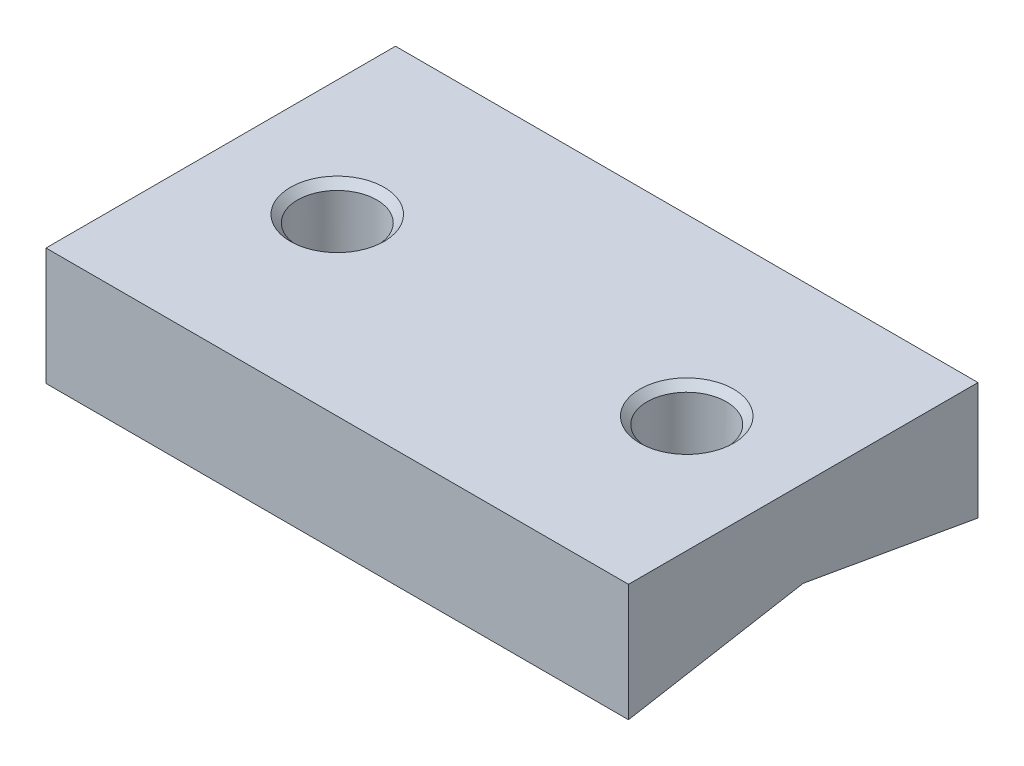
ISO-10303-21;
HEADER;
FILE_DESCRIPTION(('STEP AP214'),'2;1');
FILE_NAME('part.step','',(''),(''),'','','');
FILE_SCHEMA(('AUTOMOTIVE_DESIGN { 1 0 10303 214 1 1 1 1 }'));
ENDSEC;
DATA;
#1=APPLICATION_CONTEXT('core data for automotive mechanical design processes');
#2=APPLICATION_PROTOCOL_DEFINITION('international standard','automotive_design',2000,#1);
#3=PRODUCT_CONTEXT('',#1,'mechanical');
#4=PRODUCT('Part','Part','',(#3));
#5=PRODUCT_RELATED_PRODUCT_CATEGORY('part','',(#4));
#6=PRODUCT_DEFINITION_FORMATION('','',#4);
#7=PRODUCT_DEFINITION_CONTEXT('part definition',#1,'design');
#8=PRODUCT_DEFINITION('design','',#6,#7);
#9=PRODUCT_DEFINITION_SHAPE('','',#8);
#10=(LENGTH_UNIT() NAMED_UNIT(*) SI_UNIT(.MILLI.,.METRE.));
#11=(NAMED_UNIT(*) PLANE_ANGLE_UNIT() SI_UNIT($,.RADIAN.));
#12=(NAMED_UNIT(*) SI_UNIT($,.STERADIAN.) SOLID_ANGLE_UNIT());
#13=UNCERTAINTY_MEASURE_WITH_UNIT(LENGTH_MEASURE(1.E-05),#10,'distance_accuracy_value','');
#14=(GEOMETRIC_REPRESENTATION_CONTEXT(3) GLOBAL_UNCERTAINTY_ASSIGNED_CONTEXT((#13)) GLOBAL_UNIT_ASSIGNED_CONTEXT((#10,
#11,#12)) REPRESENTATION_CONTEXT('',''));
#15=CARTESIAN_POINT('',(0.,0.,0.));
#16=DIRECTION('',(0.,0.,1.));
#17=DIRECTION('',(1.,0.,0.));
#18=AXIS2_PLACEMENT_3D('',#15,#16,#17);
#19=CARTESIAN_POINT('',(-25.,111.,-15.));
#20=DIRECTION('',(1.,0.,0.));
#21=DIRECTION('',(0.,0.,-1.));
#22=AXIS2_PLACEMENT_3D('',#19,#20,#21);
#23=PLANE('',#22);
#24=DIRECTION('',(0.,0.173648177666928,0.984807753012209));
#25=VECTOR('',#24,1.);
#26=CARTESIAN_POINT('',(-25.,97.5735144123459,-34.0276909177069));
#27=LINE('',#26,#25);
#28=CARTESIAN_POINT('',(-25.,100.928609701719,-15.));
#29=VERTEX_POINT('',#28);
#30=CARTESIAN_POINT('',(-25.,103.573514412346,0.));
#31=VERTEX_POINT('',#30);
#32=EDGE_CURVE('E64',#29,#31,#27,.T.);
#33=ORIENTED_EDGE('',*,*,#32,.T.);
#34=DIRECTION('',(0.,-0.173648177666928,0.984807753012209));
#35=VECTOR('',#34,1.);
#36=CARTESIAN_POINT('',(-25.,97.5735144123459,34.0276909177069));
#37=LINE('',#36,#35);
#38=CARTESIAN_POINT('',(-25.,100.928609701719,15.));
#39=VERTEX_POINT('',#38);
#40=EDGE_CURVE('E122',#31,#39,#37,.T.);
#41=ORIENTED_EDGE('',*,*,#40,.T.);
#42=DIRECTION('',(0.,-1.,0.));
#43=VECTOR('',#42,1.);
#44=CARTESIAN_POINT('',(-25.,111.,15.));
#45=LINE('',#44,#43);
#46=CARTESIAN_POINT('',(-25.,111.,15.));
#47=VERTEX_POINT('',#46);
#48=EDGE_CURVE('E172',#47,#39,#45,.T.);
#49=ORIENTED_EDGE('',*,*,#48,.F.);
#50=DIRECTION('',(0.,0.,1.));
#51=VECTOR('',#50,1.);
#52=CARTESIAN_POINT('',(-25.,111.,-15.));
#53=LINE('',#52,#51);
#54=CARTESIAN_POINT('',(-25.,111.,-15.));
#55=VERTEX_POINT('',#54);
#56=EDGE_CURVE('E157',#55,#47,#53,.T.);
#57=ORIENTED_EDGE('',*,*,#56,.F.);
#58=DIRECTION('',(0.,-1.,0.));
#59=VECTOR('',#58,1.);
#60=CARTESIAN_POINT('',(-25.,111.,-15.));
#61=LINE('',#60,#59);
#62=EDGE_CURVE('E166',#55,#29,#61,.T.);
#63=ORIENTED_EDGE('',*,*,#62,.T.);
#64=EDGE_LOOP('',(#33,#41,#49,#57,#63));
#65=FACE_BOUND('',#64,.T.);
#66=ADVANCED_FACE('F50',(#65),#23,.F.);
#67=CARTESIAN_POINT('',(-25.,111.,15.));
#68=DIRECTION('',(0.,0.,-1.));
#69=DIRECTION('',(-1.,0.,0.));
#70=AXIS2_PLACEMENT_3D('',#67,#68,#69);
#71=PLANE('',#70);
#72=ORIENTED_EDGE('',*,*,#48,.T.);
#73=DIRECTION('',(1.,0.,0.));
#74=VECTOR('',#73,1.);
#75=CARTESIAN_POINT('',(-25.,100.928609701719,15.));
#76=LINE('',#75,#74);
#77=CARTESIAN_POINT('',(25.,100.928609701719,15.));
#78=VERTEX_POINT('',#77);
#79=EDGE_CURVE('E143',#39,#78,#76,.T.);
#80=ORIENTED_EDGE('',*,*,#79,.T.);
#81=DIRECTION('',(0.,-1.,0.));
#82=VECTOR('',#81,1.);
#83=CARTESIAN_POINT('',(25.,111.,15.));
#84=LINE('',#83,#82);
#85=CARTESIAN_POINT('',(25.,111.,15.));
#86=VERTEX_POINT('',#85);
#87=EDGE_CURVE('E129',#86,#78,#84,.T.);
#88=ORIENTED_EDGE('',*,*,#87,.F.);
#89=DIRECTION('',(1.,0.,0.));
#90=VECTOR('',#89,1.);
#91=CARTESIAN_POINT('',(-25.,111.,15.));
#92=LINE('',#91,#90);
#93=EDGE_CURVE('E160',#47,#86,#92,.T.);
#94=ORIENTED_EDGE('',*,*,#93,.F.);
#95=EDGE_LOOP('',(#72,#80,#88,#94));
#96=FACE_BOUND('',#95,.T.);
#97=ADVANCED_FACE('F190',(#96),#71,.F.);
#98=CARTESIAN_POINT('',(25.,111.,-15.));
#99=DIRECTION('',(-1.,0.,0.));
#100=DIRECTION('',(0.,0.,1.));
#101=AXIS2_PLACEMENT_3D('',#98,#99,#100);
#102=PLANE('',#101);
#103=ORIENTED_EDGE('',*,*,#87,.T.);
#104=DIRECTION('',(0.,-0.173648177666928,0.984807753012209));
#105=VECTOR('',#104,1.);
#106=CARTESIAN_POINT('',(25.,97.5735144123459,34.0276909177069));
#107=LINE('',#106,#105);
#108=CARTESIAN_POINT('',(25.,103.573514412346,0.));
#109=VERTEX_POINT('',#108);
#110=EDGE_CURVE('E115',#109,#78,#107,.T.);
#111=ORIENTED_EDGE('',*,*,#110,.F.);
#112=DIRECTION('',(0.,0.173648177666928,0.984807753012209));
#113=VECTOR('',#112,1.);
#114=CARTESIAN_POINT('',(25.,97.5735144123459,-34.0276909177069));
#115=LINE('',#114,#113);
#116=CARTESIAN_POINT('',(25.,100.928609701719,-15.));
#117=VERTEX_POINT('',#116);
#118=EDGE_CURVE('E105',#117,#109,#115,.T.);
#119=ORIENTED_EDGE('',*,*,#118,.F.);
#120=DIRECTION('',(0.,-1.,0.));
#121=VECTOR('',#120,1.);
#122=CARTESIAN_POINT('',(25.,111.,-15.));
#123=LINE('',#122,#121);
#124=CARTESIAN_POINT('',(25.,111.,-15.));
#125=VERTEX_POINT('',#124);
#126=EDGE_CURVE('E169',#125,#117,#123,.T.);
#127=ORIENTED_EDGE('',*,*,#126,.F.);
#128=DIRECTION('',(0.,0.,-1.));
#129=VECTOR('',#128,1.);
#130=CARTESIAN_POINT('',(25.,111.,-15.));
#131=LINE('',#130,#129);
#132=EDGE_CURVE('E162',#86,#125,#131,.T.);
#133=ORIENTED_EDGE('',*,*,#132,.F.);
#134=EDGE_LOOP('',(#103,#111,#119,#127,#133));
#135=FACE_BOUND('',#134,.T.);
#136=ADVANCED_FACE('F126',(#135),#102,.F.);
#137=CARTESIAN_POINT('',(-25.,111.,-15.));
#138=DIRECTION('',(0.,0.,1.));
#139=DIRECTION('',(1.,0.,0.));
#140=AXIS2_PLACEMENT_3D('',#137,#138,#139);
#141=PLANE('',#140);
#142=ORIENTED_EDGE('',*,*,#126,.T.);
#143=DIRECTION('',(-1.,0.,0.));
#144=VECTOR('',#143,1.);
#145=CARTESIAN_POINT('',(-25.,100.928609701719,-15.));
#146=LINE('',#145,#144);
#147=EDGE_CURVE('E110',#117,#29,#146,.T.);
#148=ORIENTED_EDGE('',*,*,#147,.T.);
#149=ORIENTED_EDGE('',*,*,#62,.F.);
#150=DIRECTION('',(-1.,0.,0.));
#151=VECTOR('',#150,1.);
#152=CARTESIAN_POINT('',(-25.,111.,-15.));
#153=LINE('',#152,#151);
#154=EDGE_CURVE('E164',#125,#55,#153,.T.);
#155=ORIENTED_EDGE('',*,*,#154,.F.);
#156=EDGE_LOOP('',(#142,#148,#149,#155));
#157=FACE_BOUND('',#156,.T.);
#158=ADVANCED_FACE('F186',(#157),#141,.F.);
#159=CARTESIAN_POINT('',(0.,111.,0.));
#160=DIRECTION('',(0.,1.,0.));
#161=DIRECTION('',(0.,0.,1.));
#162=AXIS2_PLACEMENT_3D('',#159,#160,#161);
#163=PLANE('',#162);
#164=CARTESIAN_POINT('',(15.,111.,0.));
#165=DIRECTION('',(0.,1.,0.));
#166=DIRECTION('',(0.,0.,1.));
#167=AXIS2_PLACEMENT_3D('',#164,#165,#166);
#168=CIRCLE('',#167,4.025);
#169=CARTESIAN_POINT('',(15.,111.,4.025));
#170=VERTEX_POINT('',#169);
#171=EDGE_CURVE('E145',#170,#170,#168,.T.);
#172=ORIENTED_EDGE('',*,*,#171,.F.);
#173=EDGE_LOOP('',(#172));
#174=FACE_BOUND('',#173,.T.);
#175=CARTESIAN_POINT('',(-15.,111.,0.));
#176=DIRECTION('',(0.,1.,0.));
#177=DIRECTION('',(0.,0.,1.));
#178=AXIS2_PLACEMENT_3D('',#175,#176,#177);
#179=CIRCLE('',#178,4.025);
#180=CARTESIAN_POINT('',(-15.,111.,4.025));
#181=VERTEX_POINT('',#180);
#182=EDGE_CURVE('E151',#181,#181,#179,.T.);
#183=ORIENTED_EDGE('',*,*,#182,.F.);
#184=EDGE_LOOP('',(#183));
#185=FACE_BOUND('',#184,.T.);
#186=ORIENTED_EDGE('',*,*,#56,.T.);
#187=ORIENTED_EDGE('',*,*,#93,.T.);
#188=ORIENTED_EDGE('',*,*,#132,.T.);
#189=ORIENTED_EDGE('',*,*,#154,.T.);
#190=EDGE_LOOP('',(#186,#187,#188,#189));
#191=FACE_BOUND('',#190,.T.);
#192=ADVANCED_FACE('F188',(#174,#185,#191),#163,.T.);
#193=CARTESIAN_POINT('',(-15.,111.,0.));
#194=DIRECTION('',(0.,1.,0.));
#195=DIRECTION('',(0.,0.,1.));
#196=AXIS2_PLACEMENT_3D('',#193,#194,#195);
#197=CYLINDRICAL_SURFACE('',#196,3.39999999999999);
#198=CARTESIAN_POINT('',(-15.,103.573514412346,0.));
#199=DIRECTION('',(0.,0.984807753012209,-0.173648177666927));
#200=DIRECTION('',(0.,0.173648177666927,0.984807753012209));
#201=AXIS2_PLACEMENT_3D('',#198,#199,#200);
#202=ELLIPSE('',#201,3.45245048041152,3.39999999999999);
#203=CARTESIAN_POINT('',(-18.4,103.573514412346,0.));
#204=VERTEX_POINT('',#203);
#205=CARTESIAN_POINT('',(-11.6,103.573514412346,0.));
#206=VERTEX_POINT('',#205);
#207=EDGE_CURVE('E136',#204,#206,#202,.F.);
#208=ORIENTED_EDGE('',*,*,#207,.T.);
#209=CARTESIAN_POINT('',(-15.,103.573514412346,0.));
#210=DIRECTION('',(0.,0.984807753012209,0.173648177666927));
#211=DIRECTION('',(0.,0.173648177666927,-0.984807753012209));
#212=AXIS2_PLACEMENT_3D('',#209,#210,#211);
#213=ELLIPSE('',#212,3.45245048041152,3.39999999999999);
#214=EDGE_CURVE('E140',#206,#204,#213,.F.);
#215=ORIENTED_EDGE('',*,*,#214,.T.);
#216=EDGE_LOOP('',(#208,#215));
#217=FACE_BOUND('',#216,.T.);
#218=CARTESIAN_POINT('',(-15.,110.375,0.));
#219=DIRECTION('',(0.,1.,0.));
#220=DIRECTION('',(0.,0.,1.));
#221=AXIS2_PLACEMENT_3D('',#218,#219,#220);
#222=CIRCLE('',#221,3.39999999999999);
#223=CARTESIAN_POINT('',(-15.,110.375,3.39999999999999));
#224=VERTEX_POINT('',#223);
#225=EDGE_CURVE('E154',#224,#224,#222,.T.);
#226=ORIENTED_EDGE('',*,*,#225,.T.);
#227=EDGE_LOOP('',(#226));
#228=FACE_BOUND('',#227,.T.);
#229=ADVANCED_FACE('F178',(#217,#228),#197,.F.);
#230=CARTESIAN_POINT('',(-15.,111.,0.));
#231=DIRECTION('',(0.,1.,0.));
#232=DIRECTION('',(0.,0.,1.));
#233=AXIS2_PLACEMENT_3D('',#230,#231,#232);
#234=CONICAL_SURFACE('',#233,4.025,0.785398163397447);
#235=ORIENTED_EDGE('',*,*,#225,.F.);
#236=EDGE_LOOP('',(#235));
#237=FACE_BOUND('',#236,.T.);
#238=ORIENTED_EDGE('',*,*,#182,.T.);
#239=EDGE_LOOP('',(#238));
#240=FACE_BOUND('',#239,.T.);
#241=ADVANCED_FACE('F205',(#237,#240),#234,.F.);
#242=CARTESIAN_POINT('',(15.,111.,0.));
#243=DIRECTION('',(0.,1.,0.));
#244=DIRECTION('',(0.,0.,1.));
#245=AXIS2_PLACEMENT_3D('',#242,#243,#244);
#246=CYLINDRICAL_SURFACE('',#245,3.39999999999999);
#247=CARTESIAN_POINT('',(15.,103.573514412346,0.));
#248=DIRECTION('',(0.,0.984807753012209,-0.173648177666927));
#249=DIRECTION('',(0.,0.173648177666927,0.984807753012209));
#250=AXIS2_PLACEMENT_3D('',#247,#248,#249);
#251=ELLIPSE('',#250,3.45245048041152,3.39999999999999);
#252=CARTESIAN_POINT('',(11.6,103.573514412346,0.));
#253=VERTEX_POINT('',#252);
#254=CARTESIAN_POINT('',(18.4,103.573514412346,0.));
#255=VERTEX_POINT('',#254);
#256=EDGE_CURVE('E57',#253,#255,#251,.F.);
#257=ORIENTED_EDGE('',*,*,#256,.T.);
#258=CARTESIAN_POINT('',(15.,103.573514412346,0.));
#259=DIRECTION('',(0.,0.984807753012209,0.173648177666927));
#260=DIRECTION('',(0.,0.173648177666927,-0.984807753012209));
#261=AXIS2_PLACEMENT_3D('',#258,#259,#260);
#262=ELLIPSE('',#261,3.45245048041152,3.39999999999999);
#263=EDGE_CURVE('E13',#255,#253,#262,.F.);
#264=ORIENTED_EDGE('',*,*,#263,.T.);
#265=EDGE_LOOP('',(#257,#264));
#266=FACE_BOUND('',#265,.T.);
#267=CARTESIAN_POINT('',(15.,110.375,0.));
#268=DIRECTION('',(0.,1.,0.));
#269=DIRECTION('',(0.,0.,1.));
#270=AXIS2_PLACEMENT_3D('',#267,#268,#269);
#271=CIRCLE('',#270,3.39999999999999);
#272=CARTESIAN_POINT('',(15.,110.375,3.39999999999998));
#273=VERTEX_POINT('',#272);
#274=EDGE_CURVE('E148',#273,#273,#271,.T.);
#275=ORIENTED_EDGE('',*,*,#274,.T.);
#276=EDGE_LOOP('',(#275));
#277=FACE_BOUND('',#276,.T.);
#278=ADVANCED_FACE('F175',(#266,#277),#246,.F.);
#279=CARTESIAN_POINT('',(15.,111.,0.));
#280=DIRECTION('',(0.,1.,0.));
#281=DIRECTION('',(0.,0.,1.));
#282=AXIS2_PLACEMENT_3D('',#279,#280,#281);
#283=CONICAL_SURFACE('',#282,4.025,0.785398163397448);
#284=ORIENTED_EDGE('',*,*,#274,.F.);
#285=EDGE_LOOP('',(#284));
#286=FACE_BOUND('',#285,.T.);
#287=ORIENTED_EDGE('',*,*,#171,.T.);
#288=EDGE_LOOP('',(#287));
#289=FACE_BOUND('',#288,.T.);
#290=ADVANCED_FACE('F211',(#286,#289),#283,.F.);
#291=CARTESIAN_POINT('',(-25.,97.5735144123459,34.0276909177069));
#292=DIRECTION('',(0.,0.984807753012209,0.173648177666927));
#293=DIRECTION('',(0.,-0.173648177666927,0.984807753012209));
#294=AXIS2_PLACEMENT_3D('',#291,#292,#293);
#295=PLANE('',#294);
#296=ORIENTED_EDGE('',*,*,#40,.F.);
#297=DIRECTION('',(1.,0.,0.));
#298=VECTOR('',#297,1.);
#299=CARTESIAN_POINT('',(-25.,103.573514412346,0.));
#300=LINE('',#299,#298);
#301=EDGE_CURVE('E124',#31,#204,#300,.T.);
#302=ORIENTED_EDGE('',*,*,#301,.T.);
#303=ORIENTED_EDGE('',*,*,#214,.F.);
#304=EDGE_CURVE('E71',#206,#253,#300,.T.);
#305=ORIENTED_EDGE('',*,*,#304,.T.);
#306=ORIENTED_EDGE('',*,*,#263,.F.);
#307=EDGE_CURVE('E108',#255,#109,#300,.T.);
#308=ORIENTED_EDGE('',*,*,#307,.T.);
#309=ORIENTED_EDGE('',*,*,#110,.T.);
#310=ORIENTED_EDGE('',*,*,#79,.F.);
#311=EDGE_LOOP('',(#296,#302,#303,#305,#306,#308,#309,#310));
#312=FACE_BOUND('',#311,.T.);
#313=ADVANCED_FACE('F119',(#312),#295,.F.);
#314=CARTESIAN_POINT('',(-25.,97.5735144123459,-34.0276909177069));
#315=DIRECTION('',(0.,0.984807753012209,-0.173648177666927));
#316=DIRECTION('',(0.,0.173648177666927,0.984807753012209));
#317=AXIS2_PLACEMENT_3D('',#314,#315,#316);
#318=PLANE('',#317);
#319=ORIENTED_EDGE('',*,*,#118,.T.);
#320=ORIENTED_EDGE('',*,*,#307,.F.);
#321=ORIENTED_EDGE('',*,*,#256,.F.);
#322=ORIENTED_EDGE('',*,*,#304,.F.);
#323=ORIENTED_EDGE('',*,*,#207,.F.);
#324=ORIENTED_EDGE('',*,*,#301,.F.);
#325=ORIENTED_EDGE('',*,*,#32,.F.);
#326=ORIENTED_EDGE('',*,*,#147,.F.);
#327=EDGE_LOOP('',(#319,#320,#321,#322,#323,#324,#325,#326));
#328=FACE_BOUND('',#327,.T.);
#329=ADVANCED_FACE('F107',(#328),#318,.F.);
#330=CLOSED_SHELL('',(#66,#97,#136,#158,#192,#229,#241,#278,#290,#313,#329));
#331=MANIFOLD_SOLID_BREP('B2',#330);
#332=ADVANCED_BREP_SHAPE_REPRESENTATION('',(#18,#331),#14);
#333=SHAPE_DEFINITION_REPRESENTATION(#9,#332);
ENDSEC;
END-ISO-10303-21;
